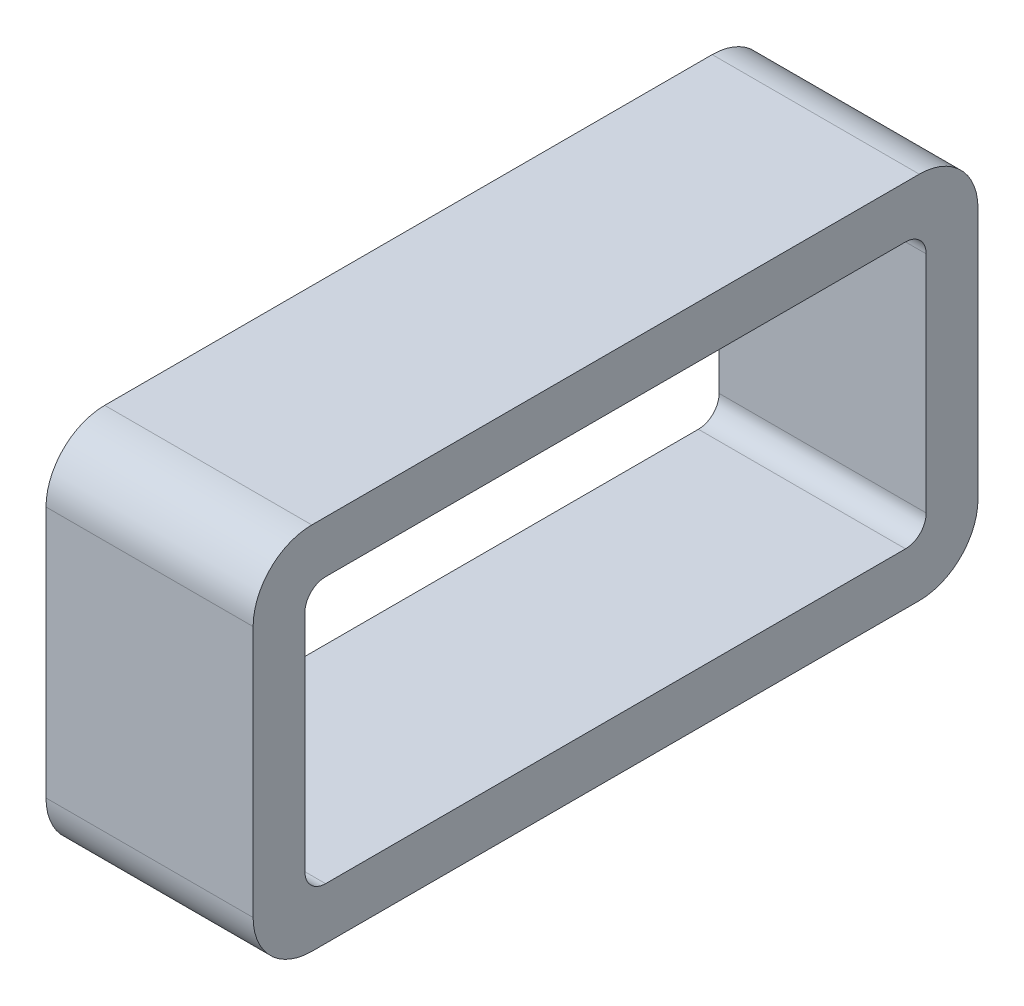
ISO-10303-21;
HEADER;
FILE_DESCRIPTION(('STEP AP214'),'2;1');
FILE_NAME('part.step','',(''),(''),'','','');
FILE_SCHEMA(('AUTOMOTIVE_DESIGN { 1 0 10303 214 1 1 1 1 }'));
ENDSEC;
DATA;
#1=APPLICATION_CONTEXT('core data for automotive mechanical design processes');
#2=APPLICATION_PROTOCOL_DEFINITION('international standard','automotive_design',2000,#1);
#3=PRODUCT_CONTEXT('',#1,'mechanical');
#4=PRODUCT('Part','Part','',(#3));
#5=PRODUCT_RELATED_PRODUCT_CATEGORY('part','',(#4));
#6=PRODUCT_DEFINITION_FORMATION('','',#4);
#7=PRODUCT_DEFINITION_CONTEXT('part definition',#1,'design');
#8=PRODUCT_DEFINITION('design','',#6,#7);
#9=PRODUCT_DEFINITION_SHAPE('','',#8);
#10=(LENGTH_UNIT() NAMED_UNIT(*) SI_UNIT(.MILLI.,.METRE.));
#11=(NAMED_UNIT(*) PLANE_ANGLE_UNIT() SI_UNIT($,.RADIAN.));
#12=(NAMED_UNIT(*) SI_UNIT($,.STERADIAN.) SOLID_ANGLE_UNIT());
#13=UNCERTAINTY_MEASURE_WITH_UNIT(LENGTH_MEASURE(1.E-05),#10,'distance_accuracy_value','');
#14=(GEOMETRIC_REPRESENTATION_CONTEXT(3) GLOBAL_UNCERTAINTY_ASSIGNED_CONTEXT((#13)) GLOBAL_UNIT_ASSIGNED_CONTEXT((#10,
#11,#12)) REPRESENTATION_CONTEXT('',''));
#15=CARTESIAN_POINT('',(0.,0.,0.));
#16=DIRECTION('',(0.,0.,1.));
#17=DIRECTION('',(1.,0.,0.));
#18=AXIS2_PLACEMENT_3D('',#15,#16,#17);
#19=CARTESIAN_POINT('',(6.,0.,0.));
#20=DIRECTION('',(1.,0.,0.));
#21=DIRECTION('',(0.,0.,-1.));
#22=AXIS2_PLACEMENT_3D('',#19,#20,#21);
#23=PLANE('',#22);
#24=DIRECTION('',(0.,-1.,0.));
#25=VECTOR('',#24,1.);
#26=CARTESIAN_POINT('',(6.,5.35,10.5));
#27=LINE('',#26,#25);
#28=CARTESIAN_POINT('',(6.,3.65,10.5));
#29=VERTEX_POINT('',#28);
#30=CARTESIAN_POINT('',(6.,-3.65,10.5));
#31=VERTEX_POINT('',#30);
#32=EDGE_CURVE('E177',#29,#31,#27,.T.);
#33=ORIENTED_EDGE('',*,*,#32,.T.);
#34=CARTESIAN_POINT('',(6.,-3.65,8.8));
#35=DIRECTION('',(1.,0.,0.));
#36=DIRECTION('',(0.,0.,-1.));
#37=AXIS2_PLACEMENT_3D('',#34,#35,#36);
#38=CIRCLE('',#37,1.7);
#39=CARTESIAN_POINT('',(6.,-5.35,8.8));
#40=VERTEX_POINT('',#39);
#41=EDGE_CURVE('E231',#31,#40,#38,.T.);
#42=ORIENTED_EDGE('',*,*,#41,.T.);
#43=DIRECTION('',(0.,0.,-1.));
#44=VECTOR('',#43,1.);
#45=CARTESIAN_POINT('',(6.,-5.35,10.5));
#46=LINE('',#45,#44);
#47=CARTESIAN_POINT('',(6.,-5.35,-8.8));
#48=VERTEX_POINT('',#47);
#49=EDGE_CURVE('E172',#40,#48,#46,.T.);
#50=ORIENTED_EDGE('',*,*,#49,.T.);
#51=CARTESIAN_POINT('',(6.,-3.65,-8.8));
#52=DIRECTION('',(1.,0.,0.));
#53=DIRECTION('',(0.,0.,-1.));
#54=AXIS2_PLACEMENT_3D('',#51,#52,#53);
#55=CIRCLE('',#54,1.7);
#56=CARTESIAN_POINT('',(6.,-3.65,-10.5));
#57=VERTEX_POINT('',#56);
#58=EDGE_CURVE('E229',#48,#57,#55,.T.);
#59=ORIENTED_EDGE('',*,*,#58,.T.);
#60=DIRECTION('',(0.,1.,0.));
#61=VECTOR('',#60,1.);
#62=CARTESIAN_POINT('',(6.,5.35,-10.5));
#63=LINE('',#62,#61);
#64=CARTESIAN_POINT('',(6.,3.65,-10.5));
#65=VERTEX_POINT('',#64);
#66=EDGE_CURVE('E245',#57,#65,#63,.T.);
#67=ORIENTED_EDGE('',*,*,#66,.T.);
#68=CARTESIAN_POINT('',(6.,3.65,-8.8));
#69=DIRECTION('',(1.,0.,0.));
#70=DIRECTION('',(0.,0.,-1.));
#71=AXIS2_PLACEMENT_3D('',#68,#69,#70);
#72=CIRCLE('',#71,1.7);
#73=CARTESIAN_POINT('',(6.,5.35,-8.8));
#74=VERTEX_POINT('',#73);
#75=EDGE_CURVE('E54',#65,#74,#72,.T.);
#76=ORIENTED_EDGE('',*,*,#75,.T.);
#77=DIRECTION('',(0.,0.,1.));
#78=VECTOR('',#77,1.);
#79=CARTESIAN_POINT('',(6.,5.35,10.5));
#80=LINE('',#79,#78);
#81=CARTESIAN_POINT('',(6.,5.35,8.8));
#82=VERTEX_POINT('',#81);
#83=EDGE_CURVE('E266',#74,#82,#80,.T.);
#84=ORIENTED_EDGE('',*,*,#83,.T.);
#85=CARTESIAN_POINT('',(6.,3.65,8.8));
#86=DIRECTION('',(1.,0.,0.));
#87=DIRECTION('',(0.,0.,-1.));
#88=AXIS2_PLACEMENT_3D('',#85,#86,#87);
#89=CIRCLE('',#88,1.7);
#90=EDGE_CURVE('E226',#82,#29,#89,.T.);
#91=ORIENTED_EDGE('',*,*,#90,.T.);
#92=EDGE_LOOP('',(#33,#42,#50,#59,#67,#76,#84,#91));
#93=FACE_BOUND('',#92,.T.);
#94=DIRECTION('',(0.,0.,1.));
#95=VECTOR('',#94,1.);
#96=CARTESIAN_POINT('',(6.,3.85,9.));
#97=LINE('',#96,#95);
#98=CARTESIAN_POINT('',(6.,3.85,-8.4));
#99=VERTEX_POINT('',#98);
#100=CARTESIAN_POINT('',(6.,3.85,8.4));
#101=VERTEX_POINT('',#100);
#102=EDGE_CURVE('E450',#99,#101,#97,.T.);
#103=ORIENTED_EDGE('',*,*,#102,.F.);
#104=CARTESIAN_POINT('',(6.,3.25,-8.4));
#105=DIRECTION('',(1.,0.,0.));
#106=DIRECTION('',(0.,0.,-1.));
#107=AXIS2_PLACEMENT_3D('',#104,#105,#106);
#108=CIRCLE('',#107,0.6);
#109=CARTESIAN_POINT('',(6.,3.25,-9.));
#110=VERTEX_POINT('',#109);
#111=EDGE_CURVE('E206',#99,#110,#108,.F.);
#112=ORIENTED_EDGE('',*,*,#111,.T.);
#113=DIRECTION('',(0.,1.,0.));
#114=VECTOR('',#113,1.);
#115=CARTESIAN_POINT('',(6.,3.85,-9.));
#116=LINE('',#115,#114);
#117=CARTESIAN_POINT('',(6.,-3.25,-9.));
#118=VERTEX_POINT('',#117);
#119=EDGE_CURVE('E168',#118,#110,#116,.T.);
#120=ORIENTED_EDGE('',*,*,#119,.F.);
#121=CARTESIAN_POINT('',(6.,-3.25,-8.4));
#122=DIRECTION('',(1.,0.,0.));
#123=DIRECTION('',(0.,0.,-1.));
#124=AXIS2_PLACEMENT_3D('',#121,#122,#123);
#125=CIRCLE('',#124,0.6);
#126=CARTESIAN_POINT('',(6.,-3.85,-8.4));
#127=VERTEX_POINT('',#126);
#128=EDGE_CURVE('E198',#118,#127,#125,.F.);
#129=ORIENTED_EDGE('',*,*,#128,.T.);
#130=DIRECTION('',(0.,0.,-1.));
#131=VECTOR('',#130,1.);
#132=CARTESIAN_POINT('',(6.,-3.85,9.));
#133=LINE('',#132,#131);
#134=CARTESIAN_POINT('',(6.,-3.85,8.4));
#135=VERTEX_POINT('',#134);
#136=EDGE_CURVE('E253',#135,#127,#133,.T.);
#137=ORIENTED_EDGE('',*,*,#136,.F.);
#138=CARTESIAN_POINT('',(6.,-3.25,8.4));
#139=DIRECTION('',(1.,0.,0.));
#140=DIRECTION('',(0.,0.,-1.));
#141=AXIS2_PLACEMENT_3D('',#138,#139,#140);
#142=CIRCLE('',#141,0.6);
#143=CARTESIAN_POINT('',(6.,-3.25,9.));
#144=VERTEX_POINT('',#143);
#145=EDGE_CURVE('E157',#135,#144,#142,.F.);
#146=ORIENTED_EDGE('',*,*,#145,.T.);
#147=DIRECTION('',(0.,-1.,0.));
#148=VECTOR('',#147,1.);
#149=CARTESIAN_POINT('',(6.,3.85,9.));
#150=LINE('',#149,#148);
#151=CARTESIAN_POINT('',(6.,3.25,9.));
#152=VERTEX_POINT('',#151);
#153=EDGE_CURVE('E257',#152,#144,#150,.T.);
#154=ORIENTED_EDGE('',*,*,#153,.F.);
#155=CARTESIAN_POINT('',(6.,3.25,8.4));
#156=DIRECTION('',(1.,0.,0.));
#157=DIRECTION('',(0.,0.,-1.));
#158=AXIS2_PLACEMENT_3D('',#155,#156,#157);
#159=CIRCLE('',#158,0.6);
#160=EDGE_CURVE('E158',#152,#101,#159,.F.);
#161=ORIENTED_EDGE('',*,*,#160,.T.);
#162=EDGE_LOOP('',(#103,#112,#120,#129,#137,#146,#154,#161));
#163=FACE_BOUND('',#162,.T.);
#164=ADVANCED_FACE('F33',(#93,#163),#23,.T.);
#165=CARTESIAN_POINT('',(0.,0.,0.));
#166=DIRECTION('',(1.,0.,0.));
#167=DIRECTION('',(0.,0.,-1.));
#168=AXIS2_PLACEMENT_3D('',#165,#166,#167);
#169=PLANE('',#168);
#170=DIRECTION('',(0.,0.,-1.));
#171=VECTOR('',#170,1.);
#172=CARTESIAN_POINT('',(0.,-5.35,10.5));
#173=LINE('',#172,#171);
#174=CARTESIAN_POINT('',(0.,-5.35,8.8));
#175=VERTEX_POINT('',#174);
#176=CARTESIAN_POINT('',(0.,-5.35,-8.8));
#177=VERTEX_POINT('',#176);
#178=EDGE_CURVE('E180',#175,#177,#173,.T.);
#179=ORIENTED_EDGE('',*,*,#178,.F.);
#180=CARTESIAN_POINT('',(0.,-3.65,8.8));
#181=DIRECTION('',(1.,0.,0.));
#182=DIRECTION('',(0.,0.,-1.));
#183=AXIS2_PLACEMENT_3D('',#180,#181,#182);
#184=CIRCLE('',#183,1.7);
#185=CARTESIAN_POINT('',(0.,-3.65,10.5));
#186=VERTEX_POINT('',#185);
#187=EDGE_CURVE('E219',#175,#186,#184,.F.);
#188=ORIENTED_EDGE('',*,*,#187,.T.);
#189=DIRECTION('',(0.,-1.,0.));
#190=VECTOR('',#189,1.);
#191=CARTESIAN_POINT('',(0.,5.35,10.5));
#192=LINE('',#191,#190);
#193=CARTESIAN_POINT('',(0.,3.65,10.5));
#194=VERTEX_POINT('',#193);
#195=EDGE_CURVE('E255',#194,#186,#192,.T.);
#196=ORIENTED_EDGE('',*,*,#195,.F.);
#197=CARTESIAN_POINT('',(0.,3.65,8.8));
#198=DIRECTION('',(1.,0.,0.));
#199=DIRECTION('',(0.,0.,-1.));
#200=AXIS2_PLACEMENT_3D('',#197,#198,#199);
#201=CIRCLE('',#200,1.7);
#202=CARTESIAN_POINT('',(0.,5.35,8.8));
#203=VERTEX_POINT('',#202);
#204=EDGE_CURVE('E213',#194,#203,#201,.F.);
#205=ORIENTED_EDGE('',*,*,#204,.T.);
#206=DIRECTION('',(0.,0.,1.));
#207=VECTOR('',#206,1.);
#208=CARTESIAN_POINT('',(0.,5.35,10.5));
#209=LINE('',#208,#207);
#210=CARTESIAN_POINT('',(0.,5.35,-8.8));
#211=VERTEX_POINT('',#210);
#212=EDGE_CURVE('E252',#211,#203,#209,.T.);
#213=ORIENTED_EDGE('',*,*,#212,.F.);
#214=CARTESIAN_POINT('',(0.,3.65,-8.8));
#215=DIRECTION('',(1.,0.,0.));
#216=DIRECTION('',(0.,0.,-1.));
#217=AXIS2_PLACEMENT_3D('',#214,#215,#216);
#218=CIRCLE('',#217,1.7);
#219=CARTESIAN_POINT('',(0.,3.65,-10.5));
#220=VERTEX_POINT('',#219);
#221=EDGE_CURVE('E215',#211,#220,#218,.F.);
#222=ORIENTED_EDGE('',*,*,#221,.T.);
#223=DIRECTION('',(0.,1.,0.));
#224=VECTOR('',#223,1.);
#225=CARTESIAN_POINT('',(0.,5.35,-10.5));
#226=LINE('',#225,#224);
#227=CARTESIAN_POINT('',(0.,-3.65,-10.5));
#228=VERTEX_POINT('',#227);
#229=EDGE_CURVE('E243',#228,#220,#226,.T.);
#230=ORIENTED_EDGE('',*,*,#229,.F.);
#231=CARTESIAN_POINT('',(0.,-3.65,-8.8));
#232=DIRECTION('',(1.,0.,0.));
#233=DIRECTION('',(0.,0.,-1.));
#234=AXIS2_PLACEMENT_3D('',#231,#232,#233);
#235=CIRCLE('',#234,1.7);
#236=EDGE_CURVE('E217',#228,#177,#235,.F.);
#237=ORIENTED_EDGE('',*,*,#236,.T.);
#238=EDGE_LOOP('',(#179,#188,#196,#205,#213,#222,#230,#237));
#239=FACE_BOUND('',#238,.T.);
#240=DIRECTION('',(0.,0.,-1.));
#241=VECTOR('',#240,1.);
#242=CARTESIAN_POINT('',(0.,-3.85,9.));
#243=LINE('',#242,#241);
#244=CARTESIAN_POINT('',(0.,-3.85,8.4));
#245=VERTEX_POINT('',#244);
#246=CARTESIAN_POINT('',(0.,-3.85,-8.4));
#247=VERTEX_POINT('',#246);
#248=EDGE_CURVE('E150',#245,#247,#243,.T.);
#249=ORIENTED_EDGE('',*,*,#248,.T.);
#250=CARTESIAN_POINT('',(0.,-3.25,-8.4));
#251=DIRECTION('',(1.,0.,0.));
#252=DIRECTION('',(0.,0.,-1.));
#253=AXIS2_PLACEMENT_3D('',#250,#251,#252);
#254=CIRCLE('',#253,0.6);
#255=CARTESIAN_POINT('',(0.,-3.25,-9.));
#256=VERTEX_POINT('',#255);
#257=EDGE_CURVE('E196',#247,#256,#254,.T.);
#258=ORIENTED_EDGE('',*,*,#257,.T.);
#259=DIRECTION('',(0.,1.,0.));
#260=VECTOR('',#259,1.);
#261=CARTESIAN_POINT('',(0.,3.85,-9.));
#262=LINE('',#261,#260);
#263=CARTESIAN_POINT('',(0.,3.25,-9.));
#264=VERTEX_POINT('',#263);
#265=EDGE_CURVE('E459',#256,#264,#262,.T.);
#266=ORIENTED_EDGE('',*,*,#265,.T.);
#267=CARTESIAN_POINT('',(0.,3.25,-8.4));
#268=DIRECTION('',(1.,0.,0.));
#269=DIRECTION('',(0.,0.,-1.));
#270=AXIS2_PLACEMENT_3D('',#267,#268,#269);
#271=CIRCLE('',#270,0.6);
#272=CARTESIAN_POINT('',(0.,3.85,-8.4));
#273=VERTEX_POINT('',#272);
#274=EDGE_CURVE('E204',#264,#273,#271,.T.);
#275=ORIENTED_EDGE('',*,*,#274,.T.);
#276=DIRECTION('',(0.,0.,1.));
#277=VECTOR('',#276,1.);
#278=CARTESIAN_POINT('',(0.,3.85,9.));
#279=LINE('',#278,#277);
#280=CARTESIAN_POINT('',(0.,3.85,8.4));
#281=VERTEX_POINT('',#280);
#282=EDGE_CURVE('E461',#273,#281,#279,.T.);
#283=ORIENTED_EDGE('',*,*,#282,.T.);
#284=CARTESIAN_POINT('',(0.,3.25,8.4));
#285=DIRECTION('',(1.,0.,0.));
#286=DIRECTION('',(0.,0.,-1.));
#287=AXIS2_PLACEMENT_3D('',#284,#285,#286);
#288=CIRCLE('',#287,0.6);
#289=CARTESIAN_POINT('',(0.,3.25,9.));
#290=VERTEX_POINT('',#289);
#291=EDGE_CURVE('E200',#281,#290,#288,.T.);
#292=ORIENTED_EDGE('',*,*,#291,.T.);
#293=DIRECTION('',(0.,-1.,0.));
#294=VECTOR('',#293,1.);
#295=CARTESIAN_POINT('',(0.,3.85,9.));
#296=LINE('',#295,#294);
#297=CARTESIAN_POINT('',(0.,-3.25,9.));
#298=VERTEX_POINT('',#297);
#299=EDGE_CURVE('E152',#290,#298,#296,.T.);
#300=ORIENTED_EDGE('',*,*,#299,.T.);
#301=CARTESIAN_POINT('',(0.,-3.25,8.4));
#302=DIRECTION('',(1.,0.,0.));
#303=DIRECTION('',(0.,0.,-1.));
#304=AXIS2_PLACEMENT_3D('',#301,#302,#303);
#305=CIRCLE('',#304,0.6);
#306=EDGE_CURVE('E147',#298,#245,#305,.T.);
#307=ORIENTED_EDGE('',*,*,#306,.T.);
#308=EDGE_LOOP('',(#249,#258,#266,#275,#283,#292,#300,#307));
#309=FACE_BOUND('',#308,.T.);
#310=ADVANCED_FACE('F149',(#239,#309),#169,.F.);
#311=CARTESIAN_POINT('',(6.,5.35,-10.5));
#312=DIRECTION('',(0.,0.,1.));
#313=DIRECTION('',(1.,0.,0.));
#314=AXIS2_PLACEMENT_3D('',#311,#312,#313);
#315=PLANE('',#314);
#316=ORIENTED_EDGE('',*,*,#66,.F.);
#317=DIRECTION('',(-1.,0.,0.));
#318=VECTOR('',#317,1.);
#319=CARTESIAN_POINT('',(6.,-3.65,-10.5));
#320=LINE('',#319,#318);
#321=EDGE_CURVE('E235',#57,#228,#320,.T.);
#322=ORIENTED_EDGE('',*,*,#321,.T.);
#323=ORIENTED_EDGE('',*,*,#229,.T.);
#324=DIRECTION('',(-1.,0.,0.));
#325=VECTOR('',#324,1.);
#326=CARTESIAN_POINT('',(6.,3.65,-10.5));
#327=LINE('',#326,#325);
#328=EDGE_CURVE('E233',#220,#65,#327,.F.);
#329=ORIENTED_EDGE('',*,*,#328,.T.);
#330=EDGE_LOOP('',(#316,#322,#323,#329));
#331=FACE_BOUND('',#330,.T.);
#332=ADVANCED_FACE('F242',(#331),#315,.F.);
#333=CARTESIAN_POINT('',(6.,5.35,10.5));
#334=DIRECTION('',(0.,-1.,0.));
#335=DIRECTION('',(0.,0.,-1.));
#336=AXIS2_PLACEMENT_3D('',#333,#334,#335);
#337=PLANE('',#336);
#338=ORIENTED_EDGE('',*,*,#83,.F.);
#339=DIRECTION('',(-1.,0.,0.));
#340=VECTOR('',#339,1.);
#341=CARTESIAN_POINT('',(6.,5.35,-8.8));
#342=LINE('',#341,#340);
#343=EDGE_CURVE('E11',#74,#211,#342,.T.);
#344=ORIENTED_EDGE('',*,*,#343,.T.);
#345=ORIENTED_EDGE('',*,*,#212,.T.);
#346=DIRECTION('',(-1.,0.,0.));
#347=VECTOR('',#346,1.);
#348=CARTESIAN_POINT('',(6.,5.35,8.8));
#349=LINE('',#348,#347);
#350=EDGE_CURVE('E41',#203,#82,#349,.F.);
#351=ORIENTED_EDGE('',*,*,#350,.T.);
#352=EDGE_LOOP('',(#338,#344,#345,#351));
#353=FACE_BOUND('',#352,.T.);
#354=ADVANCED_FACE('F282',(#353),#337,.F.);
#355=CARTESIAN_POINT('',(6.,5.35,10.5));
#356=DIRECTION('',(0.,0.,-1.));
#357=DIRECTION('',(-1.,0.,0.));
#358=AXIS2_PLACEMENT_3D('',#355,#356,#357);
#359=PLANE('',#358);
#360=ORIENTED_EDGE('',*,*,#195,.T.);
#361=DIRECTION('',(-1.,0.,0.));
#362=VECTOR('',#361,1.);
#363=CARTESIAN_POINT('',(6.,-3.65,10.5));
#364=LINE('',#363,#362);
#365=EDGE_CURVE('E224',#186,#31,#364,.F.);
#366=ORIENTED_EDGE('',*,*,#365,.T.);
#367=ORIENTED_EDGE('',*,*,#32,.F.);
#368=DIRECTION('',(-1.,0.,0.));
#369=VECTOR('',#368,1.);
#370=CARTESIAN_POINT('',(6.,3.65,10.5));
#371=LINE('',#370,#369);
#372=EDGE_CURVE('E221',#29,#194,#371,.T.);
#373=ORIENTED_EDGE('',*,*,#372,.T.);
#374=EDGE_LOOP('',(#360,#366,#367,#373));
#375=FACE_BOUND('',#374,.T.);
#376=ADVANCED_FACE('F284',(#375),#359,.F.);
#377=CARTESIAN_POINT('',(6.,-5.35,10.5));
#378=DIRECTION('',(0.,1.,0.));
#379=DIRECTION('',(0.,0.,1.));
#380=AXIS2_PLACEMENT_3D('',#377,#378,#379);
#381=PLANE('',#380);
#382=ORIENTED_EDGE('',*,*,#49,.F.);
#383=DIRECTION('',(-1.,0.,0.));
#384=VECTOR('',#383,1.);
#385=CARTESIAN_POINT('',(6.,-5.35,8.8));
#386=LINE('',#385,#384);
#387=EDGE_CURVE('E210',#40,#175,#386,.T.);
#388=ORIENTED_EDGE('',*,*,#387,.T.);
#389=ORIENTED_EDGE('',*,*,#178,.T.);
#390=DIRECTION('',(-1.,0.,0.));
#391=VECTOR('',#390,1.);
#392=CARTESIAN_POINT('',(6.,-5.35,-8.8));
#393=LINE('',#392,#391);
#394=EDGE_CURVE('E208',#177,#48,#393,.F.);
#395=ORIENTED_EDGE('',*,*,#394,.T.);
#396=EDGE_LOOP('',(#382,#388,#389,#395));
#397=FACE_BOUND('',#396,.T.);
#398=ADVANCED_FACE('F280',(#397),#381,.F.);
#399=CARTESIAN_POINT('',(6.,3.85,-9.));
#400=DIRECTION('',(0.,0.,1.));
#401=DIRECTION('',(1.,0.,0.));
#402=AXIS2_PLACEMENT_3D('',#399,#400,#401);
#403=PLANE('',#402);
#404=ORIENTED_EDGE('',*,*,#265,.F.);
#405=DIRECTION('',(-1.,0.,0.));
#406=VECTOR('',#405,1.);
#407=CARTESIAN_POINT('',(6.,-3.25,-9.));
#408=LINE('',#407,#406);
#409=EDGE_CURVE('E185',#256,#118,#408,.F.);
#410=ORIENTED_EDGE('',*,*,#409,.T.);
#411=ORIENTED_EDGE('',*,*,#119,.T.);
#412=DIRECTION('',(-1.,0.,0.));
#413=VECTOR('',#412,1.);
#414=CARTESIAN_POINT('',(0.,3.25,-9.));
#415=LINE('',#414,#413);
#416=EDGE_CURVE('E174',#110,#264,#415,.T.);
#417=ORIENTED_EDGE('',*,*,#416,.T.);
#418=EDGE_LOOP('',(#404,#410,#411,#417));
#419=FACE_BOUND('',#418,.T.);
#420=ADVANCED_FACE('F291',(#419),#403,.T.);
#421=CARTESIAN_POINT('',(6.,3.85,9.));
#422=DIRECTION('',(0.,-1.,0.));
#423=DIRECTION('',(0.,0.,-1.));
#424=AXIS2_PLACEMENT_3D('',#421,#422,#423);
#425=PLANE('',#424);
#426=ORIENTED_EDGE('',*,*,#102,.T.);
#427=DIRECTION('',(-1.,0.,0.));
#428=VECTOR('',#427,1.);
#429=CARTESIAN_POINT('',(0.,3.85,8.4));
#430=LINE('',#429,#428);
#431=EDGE_CURVE('E189',#101,#281,#430,.T.);
#432=ORIENTED_EDGE('',*,*,#431,.T.);
#433=ORIENTED_EDGE('',*,*,#282,.F.);
#434=DIRECTION('',(-1.,0.,0.));
#435=VECTOR('',#434,1.);
#436=CARTESIAN_POINT('',(6.,3.85,-8.4));
#437=LINE('',#436,#435);
#438=EDGE_CURVE('E187',#273,#99,#437,.F.);
#439=ORIENTED_EDGE('',*,*,#438,.T.);
#440=EDGE_LOOP('',(#426,#432,#433,#439));
#441=FACE_BOUND('',#440,.T.);
#442=ADVANCED_FACE('F303',(#441),#425,.T.);
#443=CARTESIAN_POINT('',(6.,3.85,9.));
#444=DIRECTION('',(0.,0.,-1.));
#445=DIRECTION('',(0.,1.,0.));
#446=AXIS2_PLACEMENT_3D('',#443,#444,#445);
#447=PLANE('',#446);
#448=ORIENTED_EDGE('',*,*,#299,.F.);
#449=DIRECTION('',(-1.,0.,0.));
#450=VECTOR('',#449,1.);
#451=CARTESIAN_POINT('',(6.,3.25,9.));
#452=LINE('',#451,#450);
#453=EDGE_CURVE('E194',#290,#152,#452,.F.);
#454=ORIENTED_EDGE('',*,*,#453,.T.);
#455=ORIENTED_EDGE('',*,*,#153,.T.);
#456=DIRECTION('',(-1.,0.,0.));
#457=VECTOR('',#456,1.);
#458=CARTESIAN_POINT('',(0.,-3.25,9.));
#459=LINE('',#458,#457);
#460=EDGE_CURVE('E192',#144,#298,#459,.T.);
#461=ORIENTED_EDGE('',*,*,#460,.T.);
#462=EDGE_LOOP('',(#448,#454,#455,#461));
#463=FACE_BOUND('',#462,.T.);
#464=ADVANCED_FACE('F307',(#463),#447,.T.);
#465=CARTESIAN_POINT('',(6.,-3.85,9.));
#466=DIRECTION('',(0.,1.,0.));
#467=DIRECTION('',(0.,0.,1.));
#468=AXIS2_PLACEMENT_3D('',#465,#466,#467);
#469=PLANE('',#468);
#470=ORIENTED_EDGE('',*,*,#136,.T.);
#471=DIRECTION('',(-1.,0.,0.));
#472=VECTOR('',#471,1.);
#473=CARTESIAN_POINT('',(0.,-3.85,-8.4));
#474=LINE('',#473,#472);
#475=EDGE_CURVE('E167',#127,#247,#474,.T.);
#476=ORIENTED_EDGE('',*,*,#475,.T.);
#477=ORIENTED_EDGE('',*,*,#248,.F.);
#478=DIRECTION('',(-1.,0.,0.));
#479=VECTOR('',#478,1.);
#480=CARTESIAN_POINT('',(6.,-3.85,8.4));
#481=LINE('',#480,#479);
#482=EDGE_CURVE('E164',#245,#135,#481,.F.);
#483=ORIENTED_EDGE('',*,*,#482,.T.);
#484=EDGE_LOOP('',(#470,#476,#477,#483));
#485=FACE_BOUND('',#484,.T.);
#486=ADVANCED_FACE('F163',(#485),#469,.T.);
#487=CARTESIAN_POINT('',(6.,-3.25,-8.4));
#488=DIRECTION('',(1.,0.,0.));
#489=DIRECTION('',(0.,0.,-1.));
#490=AXIS2_PLACEMENT_3D('',#487,#488,#489);
#491=CYLINDRICAL_SURFACE('',#490,0.6);
#492=ORIENTED_EDGE('',*,*,#128,.F.);
#493=ORIENTED_EDGE('',*,*,#409,.F.);
#494=ORIENTED_EDGE('',*,*,#257,.F.);
#495=ORIENTED_EDGE('',*,*,#475,.F.);
#496=EDGE_LOOP('',(#492,#493,#494,#495));
#497=FACE_BOUND('',#496,.T.);
#498=ADVANCED_FACE('F313',(#497),#491,.F.);
#499=CARTESIAN_POINT('',(6.,3.25,8.4));
#500=DIRECTION('',(1.,0.,0.));
#501=DIRECTION('',(0.,0.,-1.));
#502=AXIS2_PLACEMENT_3D('',#499,#500,#501);
#503=CYLINDRICAL_SURFACE('',#502,0.6);
#504=ORIENTED_EDGE('',*,*,#160,.F.);
#505=ORIENTED_EDGE('',*,*,#453,.F.);
#506=ORIENTED_EDGE('',*,*,#291,.F.);
#507=ORIENTED_EDGE('',*,*,#431,.F.);
#508=EDGE_LOOP('',(#504,#505,#506,#507));
#509=FACE_BOUND('',#508,.T.);
#510=ADVANCED_FACE('F317',(#509),#503,.F.);
#511=CARTESIAN_POINT('',(6.,-3.25,8.4));
#512=DIRECTION('',(1.,0.,0.));
#513=DIRECTION('',(0.,0.,-1.));
#514=AXIS2_PLACEMENT_3D('',#511,#512,#513);
#515=CYLINDRICAL_SURFACE('',#514,0.6);
#516=ORIENTED_EDGE('',*,*,#145,.F.);
#517=ORIENTED_EDGE('',*,*,#482,.F.);
#518=ORIENTED_EDGE('',*,*,#306,.F.);
#519=ORIENTED_EDGE('',*,*,#460,.F.);
#520=EDGE_LOOP('',(#516,#517,#518,#519));
#521=FACE_BOUND('',#520,.T.);
#522=ADVANCED_FACE('F171',(#521),#515,.F.);
#523=CARTESIAN_POINT('',(6.,3.25,-8.4));
#524=DIRECTION('',(1.,0.,0.));
#525=DIRECTION('',(0.,0.,-1.));
#526=AXIS2_PLACEMENT_3D('',#523,#524,#525);
#527=CYLINDRICAL_SURFACE('',#526,0.6);
#528=ORIENTED_EDGE('',*,*,#111,.F.);
#529=ORIENTED_EDGE('',*,*,#438,.F.);
#530=ORIENTED_EDGE('',*,*,#274,.F.);
#531=ORIENTED_EDGE('',*,*,#416,.F.);
#532=EDGE_LOOP('',(#528,#529,#530,#531));
#533=FACE_BOUND('',#532,.T.);
#534=ADVANCED_FACE('F330',(#533),#527,.F.);
#535=CARTESIAN_POINT('',(6.,-3.65,8.8));
#536=DIRECTION('',(-1.,0.,0.));
#537=DIRECTION('',(0.,0.,1.));
#538=AXIS2_PLACEMENT_3D('',#535,#536,#537);
#539=CYLINDRICAL_SURFACE('',#538,1.7);
#540=ORIENTED_EDGE('',*,*,#41,.F.);
#541=ORIENTED_EDGE('',*,*,#365,.F.);
#542=ORIENTED_EDGE('',*,*,#187,.F.);
#543=ORIENTED_EDGE('',*,*,#387,.F.);
#544=EDGE_LOOP('',(#540,#541,#542,#543));
#545=FACE_BOUND('',#544,.T.);
#546=ADVANCED_FACE('F279',(#545),#539,.T.);
#547=CARTESIAN_POINT('',(6.,-3.65,-8.8));
#548=DIRECTION('',(-1.,0.,0.));
#549=DIRECTION('',(0.,0.,1.));
#550=AXIS2_PLACEMENT_3D('',#547,#548,#549);
#551=CYLINDRICAL_SURFACE('',#550,1.7);
#552=ORIENTED_EDGE('',*,*,#58,.F.);
#553=ORIENTED_EDGE('',*,*,#394,.F.);
#554=ORIENTED_EDGE('',*,*,#236,.F.);
#555=ORIENTED_EDGE('',*,*,#321,.F.);
#556=EDGE_LOOP('',(#552,#553,#554,#555));
#557=FACE_BOUND('',#556,.T.);
#558=ADVANCED_FACE('F336',(#557),#551,.T.);
#559=CARTESIAN_POINT('',(6.,3.65,-8.8));
#560=DIRECTION('',(-1.,0.,0.));
#561=DIRECTION('',(0.,0.,1.));
#562=AXIS2_PLACEMENT_3D('',#559,#560,#561);
#563=CYLINDRICAL_SURFACE('',#562,1.7);
#564=ORIENTED_EDGE('',*,*,#75,.F.);
#565=ORIENTED_EDGE('',*,*,#328,.F.);
#566=ORIENTED_EDGE('',*,*,#221,.F.);
#567=ORIENTED_EDGE('',*,*,#343,.F.);
#568=EDGE_LOOP('',(#564,#565,#566,#567));
#569=FACE_BOUND('',#568,.T.);
#570=ADVANCED_FACE('F338',(#569),#563,.T.);
#571=CARTESIAN_POINT('',(6.,3.65,8.8));
#572=DIRECTION('',(-1.,0.,0.));
#573=DIRECTION('',(0.,0.,1.));
#574=AXIS2_PLACEMENT_3D('',#571,#572,#573);
#575=CYLINDRICAL_SURFACE('',#574,1.7);
#576=ORIENTED_EDGE('',*,*,#90,.F.);
#577=ORIENTED_EDGE('',*,*,#350,.F.);
#578=ORIENTED_EDGE('',*,*,#204,.F.);
#579=ORIENTED_EDGE('',*,*,#372,.F.);
#580=EDGE_LOOP('',(#576,#577,#578,#579));
#581=FACE_BOUND('',#580,.T.);
#582=ADVANCED_FACE('F35',(#581),#575,.T.);
#583=CLOSED_SHELL('',(#164,#310,#332,#354,#376,#398,#420,#442,#464,#486,#498,#510,#522,#534,
#546,#558,#570,#582));
#584=MANIFOLD_SOLID_BREP('B2',#583);
#585=ADVANCED_BREP_SHAPE_REPRESENTATION('',(#18,#584),#14);
#586=SHAPE_DEFINITION_REPRESENTATION(#9,#585);
ENDSEC;
END-ISO-10303-21;
